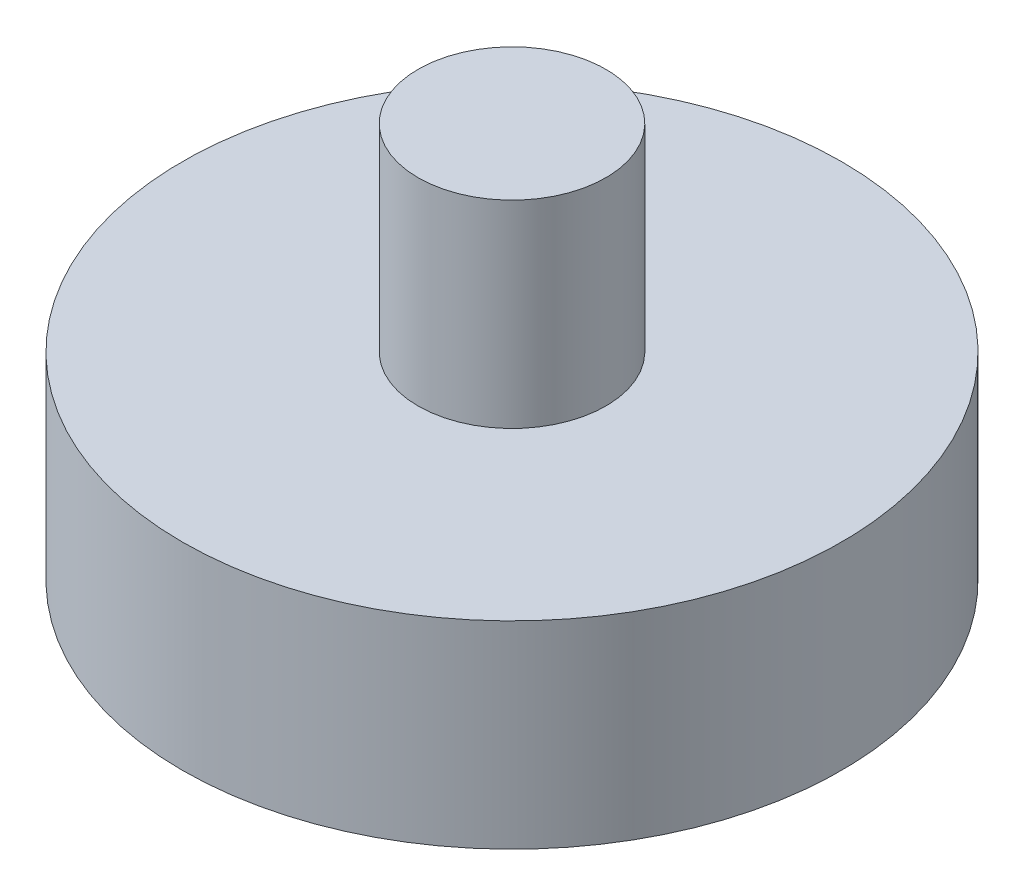
ISO-10303-21;
HEADER;
FILE_DESCRIPTION(('STEP AP214'),'2;1');
FILE_NAME('part.step','',(''),(''),'','','');
FILE_SCHEMA(('AUTOMOTIVE_DESIGN { 1 0 10303 214 1 1 1 1 }'));
ENDSEC;
DATA;
#1=APPLICATION_CONTEXT('core data for automotive mechanical design processes');
#2=APPLICATION_PROTOCOL_DEFINITION('international standard','automotive_design',2000,#1);
#3=PRODUCT_CONTEXT('',#1,'mechanical');
#4=PRODUCT('Part','Part','',(#3));
#5=PRODUCT_RELATED_PRODUCT_CATEGORY('part','',(#4));
#6=PRODUCT_DEFINITION_FORMATION('','',#4);
#7=PRODUCT_DEFINITION_CONTEXT('part definition',#1,'design');
#8=PRODUCT_DEFINITION('design','',#6,#7);
#9=PRODUCT_DEFINITION_SHAPE('','',#8);
#10=(LENGTH_UNIT() NAMED_UNIT(*) SI_UNIT(.MILLI.,.METRE.));
#11=(NAMED_UNIT(*) PLANE_ANGLE_UNIT() SI_UNIT($,.RADIAN.));
#12=(NAMED_UNIT(*) SI_UNIT($,.STERADIAN.) SOLID_ANGLE_UNIT());
#13=UNCERTAINTY_MEASURE_WITH_UNIT(LENGTH_MEASURE(1.E-05),#10,'distance_accuracy_value','');
#14=(GEOMETRIC_REPRESENTATION_CONTEXT(3) GLOBAL_UNCERTAINTY_ASSIGNED_CONTEXT((#13)) GLOBAL_UNIT_ASSIGNED_CONTEXT((#10,
#11,#12)) REPRESENTATION_CONTEXT('',''));
#15=CARTESIAN_POINT('',(0.,0.,0.));
#16=DIRECTION('',(0.,0.,1.));
#17=DIRECTION('',(1.,0.,0.));
#18=AXIS2_PLACEMENT_3D('',#15,#16,#17);
#19=CARTESIAN_POINT('',(0.,3.,0.));
#20=DIRECTION('',(0.,-1.,0.));
#21=DIRECTION('',(0.,0.,-1.));
#22=AXIS2_PLACEMENT_3D('',#19,#20,#21);
#23=CYLINDRICAL_SURFACE('',#22,5.);
#24=CARTESIAN_POINT('',(0.,3.,0.));
#25=DIRECTION('',(0.,1.,0.));
#26=DIRECTION('',(0.,0.,1.));
#27=AXIS2_PLACEMENT_3D('',#24,#25,#26);
#28=CIRCLE('',#27,5.);
#29=CARTESIAN_POINT('',(0.,3.,5.));
#30=VERTEX_POINT('',#29);
#31=EDGE_CURVE('E51',#30,#30,#28,.T.);
#32=ORIENTED_EDGE('',*,*,#31,.F.);
#33=EDGE_LOOP('',(#32));
#34=FACE_BOUND('',#33,.T.);
#35=CARTESIAN_POINT('',(0.,0.,0.));
#36=DIRECTION('',(0.,1.,0.));
#37=DIRECTION('',(0.,0.,1.));
#38=AXIS2_PLACEMENT_3D('',#35,#36,#37);
#39=CIRCLE('',#38,5.);
#40=CARTESIAN_POINT('',(0.,0.,5.));
#41=VERTEX_POINT('',#40);
#42=EDGE_CURVE('E46',#41,#41,#39,.T.);
#43=ORIENTED_EDGE('',*,*,#42,.T.);
#44=EDGE_LOOP('',(#43));
#45=FACE_BOUND('',#44,.T.);
#46=ADVANCED_FACE('F43',(#34,#45),#23,.T.);
#47=CARTESIAN_POINT('',(0.,3.,0.));
#48=DIRECTION('',(0.,1.,0.));
#49=DIRECTION('',(0.,0.,1.));
#50=AXIS2_PLACEMENT_3D('',#47,#48,#49);
#51=PLANE('',#50);
#52=CARTESIAN_POINT('',(0.,3.,0.));
#53=DIRECTION('',(0.,1.,0.));
#54=DIRECTION('',(0.,0.,1.));
#55=AXIS2_PLACEMENT_3D('',#52,#53,#54);
#56=CIRCLE('',#55,1.425);
#57=CARTESIAN_POINT('',(0.,3.,1.425));
#58=VERTEX_POINT('',#57);
#59=EDGE_CURVE('E10',#58,#58,#56,.T.);
#60=ORIENTED_EDGE('',*,*,#59,.F.);
#61=EDGE_LOOP('',(#60));
#62=FACE_BOUND('',#61,.T.);
#63=ORIENTED_EDGE('',*,*,#31,.T.);
#64=EDGE_LOOP('',(#63));
#65=FACE_BOUND('',#64,.T.);
#66=ADVANCED_FACE('F71',(#62,#65),#51,.T.);
#67=CARTESIAN_POINT('',(0.,0.,0.));
#68=DIRECTION('',(0.,1.,0.));
#69=DIRECTION('',(0.,0.,1.));
#70=AXIS2_PLACEMENT_3D('',#67,#68,#69);
#71=PLANE('',#70);
#72=ORIENTED_EDGE('',*,*,#42,.F.);
#73=EDGE_LOOP('',(#72));
#74=FACE_BOUND('',#73,.T.);
#75=ADVANCED_FACE('F68',(#74),#71,.F.);
#76=CARTESIAN_POINT('',(0.,6.,0.));
#77=DIRECTION('',(0.,-1.,0.));
#78=DIRECTION('',(0.,0.,-1.));
#79=AXIS2_PLACEMENT_3D('',#76,#77,#78);
#80=CYLINDRICAL_SURFACE('',#79,1.425);
#81=CARTESIAN_POINT('',(0.,6.,0.));
#82=DIRECTION('',(0.,1.,0.));
#83=DIRECTION('',(0.,0.,1.));
#84=AXIS2_PLACEMENT_3D('',#81,#82,#83);
#85=CIRCLE('',#84,1.425);
#86=CARTESIAN_POINT('',(0.,6.,1.425));
#87=VERTEX_POINT('',#86);
#88=EDGE_CURVE('E58',#87,#87,#85,.T.);
#89=ORIENTED_EDGE('',*,*,#88,.F.);
#90=EDGE_LOOP('',(#89));
#91=FACE_BOUND('',#90,.T.);
#92=ORIENTED_EDGE('',*,*,#59,.T.);
#93=EDGE_LOOP('',(#92));
#94=FACE_BOUND('',#93,.T.);
#95=ADVANCED_FACE('F70',(#91,#94),#80,.T.);
#96=CARTESIAN_POINT('',(0.,6.,0.));
#97=DIRECTION('',(0.,1.,0.));
#98=DIRECTION('',(0.,0.,1.));
#99=AXIS2_PLACEMENT_3D('',#96,#97,#98);
#100=PLANE('',#99);
#101=ORIENTED_EDGE('',*,*,#88,.T.);
#102=EDGE_LOOP('',(#101));
#103=FACE_BOUND('',#102,.T.);
#104=ADVANCED_FACE('F77',(#103),#100,.T.);
#105=CLOSED_SHELL('',(#46,#66,#75,#95,#104));
#106=MANIFOLD_SOLID_BREP('B2',#105);
#107=ADVANCED_BREP_SHAPE_REPRESENTATION('',(#18,#106),#14);
#108=SHAPE_DEFINITION_REPRESENTATION(#9,#107);
ENDSEC;
END-ISO-10303-21;
